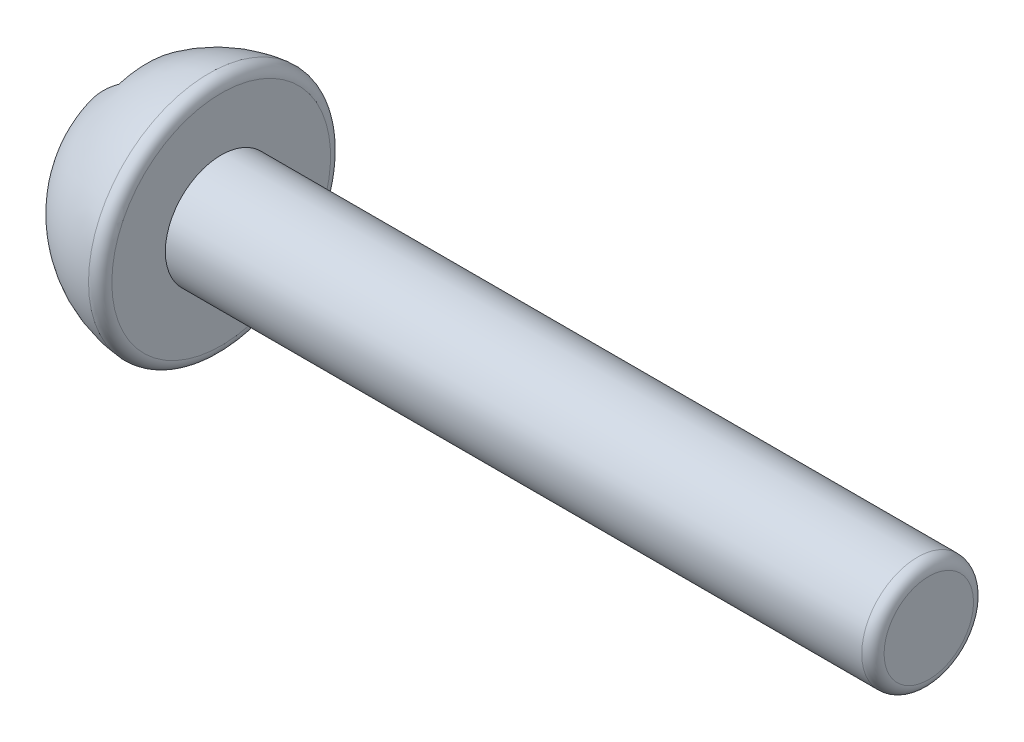
ISO-10303-21;
HEADER;
FILE_DESCRIPTION(('STEP AP214'),'2;1');
FILE_NAME('part.step','',(''),(''),'','','');
FILE_SCHEMA(('AUTOMOTIVE_DESIGN { 1 0 10303 214 1 1 1 1 }'));
ENDSEC;
DATA;
#1=APPLICATION_CONTEXT('core data for automotive mechanical design processes');
#2=APPLICATION_PROTOCOL_DEFINITION('international standard','automotive_design',2000,#1);
#3=PRODUCT_CONTEXT('',#1,'mechanical');
#4=PRODUCT('Part','Part','',(#3));
#5=PRODUCT_RELATED_PRODUCT_CATEGORY('part','',(#4));
#6=PRODUCT_DEFINITION_FORMATION('','',#4);
#7=PRODUCT_DEFINITION_CONTEXT('part definition',#1,'design');
#8=PRODUCT_DEFINITION('design','',#6,#7);
#9=PRODUCT_DEFINITION_SHAPE('','',#8);
#10=(LENGTH_UNIT() NAMED_UNIT(*) SI_UNIT(.MILLI.,.METRE.));
#11=(NAMED_UNIT(*) PLANE_ANGLE_UNIT() SI_UNIT($,.RADIAN.));
#12=(NAMED_UNIT(*) SI_UNIT($,.STERADIAN.) SOLID_ANGLE_UNIT());
#13=UNCERTAINTY_MEASURE_WITH_UNIT(LENGTH_MEASURE(1.E-05),#10,'distance_accuracy_value','');
#14=(GEOMETRIC_REPRESENTATION_CONTEXT(3) GLOBAL_UNCERTAINTY_ASSIGNED_CONTEXT((#13)) GLOBAL_UNIT_ASSIGNED_CONTEXT((#10,
#11,#12)) REPRESENTATION_CONTEXT('',''));
#15=CARTESIAN_POINT('',(0.,0.,0.));
#16=DIRECTION('',(0.,0.,1.));
#17=DIRECTION('',(1.,0.,0.));
#18=AXIS2_PLACEMENT_3D('',#15,#16,#17);
#19=CARTESIAN_POINT('',(-22.067620737631,-4.32416498627654E-08,0.));
#20=DIRECTION('',(-1.,0.,0.));
#21=DIRECTION('',(0.,0.,1.));
#22=AXIS2_PLACEMENT_3D('',#19,#20,#21);
#23=DEGENERATE_TOROIDAL_SURFACE('',#22,1.90491301343384,26.67,.F.);
#24=CARTESIAN_POINT('',(-24.4934308293997,-4.32416498627654E-08,0.));
#25=DIRECTION('',(1.,0.,0.));
#26=DIRECTION('',(0.,0.,-1.));
#27=AXIS2_PLACEMENT_3D('',#24,#25,#26);
#28=CIRCLE('',#27,24.6545362541747);
#29=CARTESIAN_POINT('',(-24.4934308293997,-4.32416498627654E-08,-24.6545362541747));
#30=VERTEX_POINT('',#29);
#31=EDGE_CURVE('E52',#30,#30,#28,.F.);
#32=ORIENTED_EDGE('',*,*,#31,.T.);
#33=EDGE_LOOP('',(#32));
#34=FACE_BOUND('',#33,.T.);
#35=CARTESIAN_POINT('',(-22.0714895535057,24.0966448384328,-5.715));
#36=CARTESIAN_POINT('',(-22.4361244723048,24.096590877898,-5.715));
#37=CARTESIAN_POINT('',(-22.8007177795977,24.088849782462,-5.715));
#38=CARTESIAN_POINT('',(-23.5292458995325,24.0580151985003,-5.715));
#39=CARTESIAN_POINT('',(-23.8931807276562,24.0349220757553,-5.715));
#40=CARTESIAN_POINT('',(-24.9829773197257,23.9426624510839,-5.715));
#41=CARTESIAN_POINT('',(-25.7070158056303,23.8505156416362,-5.715));
#42=CARTESIAN_POINT('',(-27.1446712361644,23.6055710255238,-5.715));
#43=CARTESIAN_POINT('',(-27.8582894146657,23.4527804610851,-5.715));
#44=CARTESIAN_POINT('',(-28.9169627425031,23.1789981312632,-5.715));
#45=CARTESIAN_POINT('',(-29.2679087960277,23.0802997213384,-5.715));
#46=CARTESIAN_POINT('',(-29.9654202310396,22.8681759094379,-5.715));
#47=CARTESIAN_POINT('',(-30.3119844618444,22.7547467237703,-5.715));
#48=CARTESIAN_POINT('',(-31.3442306670615,22.3926088040668,-5.715));
#49=CARTESIAN_POINT('',(-32.0223840591602,22.1220709457457,-5.715));
#50=CARTESIAN_POINT('',(-33.3534500748989,21.5247497473421,-5.715));
#51=CARTESIAN_POINT('',(-34.0063627466356,21.197966514443,-5.715));
#52=CARTESIAN_POINT('',(-34.9630062897767,20.6675250478347,-5.715));
#53=CARTESIAN_POINT('',(-35.2780559204697,20.4840296052563,-5.715));
#54=CARTESIAN_POINT('',(-35.900045778185,20.1039511619594,-5.715));
#55=CARTESIAN_POINT('',(-36.2069880617917,19.9073715257113,-5.715));
#56=CARTESIAN_POINT('',(-37.1149875363943,19.2983987892186,-5.715));
#57=CARTESIAN_POINT('',(-37.7032835889031,18.866735126589,-5.715));
#58=CARTESIAN_POINT('',(-38.8402145263512,17.9560534846728,-5.715));
#59=CARTESIAN_POINT('',(-39.3889160289397,17.4771184146399,-5.715));
#60=CARTESIAN_POINT('',(-40.4438746603184,16.4745302177951,-5.715));
#61=CARTESIAN_POINT('',(-40.9501312499793,15.9508765231443,-5.715));
#62=CARTESIAN_POINT('',(-41.9169744970546,14.8618380091056,-5.715));
#63=CARTESIAN_POINT('',(-42.3775048377737,14.2964031900953,-5.715));
#64=CARTESIAN_POINT('',(-43.2486090098142,13.1282933190146,-5.715));
#65=CARTESIAN_POINT('',(-43.6591844140949,12.5256194404129,-5.715));
#66=CARTESIAN_POINT('',(-44.4242083062479,11.2916163100681,-5.715));
#67=CARTESIAN_POINT('',(-44.7790392223492,10.6605243212926,-5.715));
#68=CARTESIAN_POINT('',(-45.4327852817211,9.36992045922785,-5.715));
#69=CARTESIAN_POINT('',(-45.7316937831532,8.71040522157344,-5.715));
#70=CARTESIAN_POINT('',(-46.2695886622245,7.36823443512176,-5.715));
#71=CARTESIAN_POINT('',(-46.5086567407336,6.68561189755952,-5.715));
#72=CARTESIAN_POINT('',(-46.8191331528736,5.64754119984467,-5.715));
#73=CARTESIAN_POINT('',(-46.9146055182085,5.29915561708614,-5.715));
#74=CARTESIAN_POINT('',(-47.0887763965613,4.59822791082223,-5.715));
#75=CARTESIAN_POINT('',(-47.1674755374269,4.24568594341821,-5.715));
#76=CARTESIAN_POINT('',(-47.3472194765031,3.33415858632676,-5.715));
#77=CARTESIAN_POINT('',(-47.435271720887,2.77250687431733,-5.715));
#78=CARTESIAN_POINT('',(-47.5316120849775,1.92616932086562,-5.715));
#79=CARTESIAN_POINT('',(-47.5577692543778,1.64341180783531,-5.715));
#80=CARTESIAN_POINT('',(-47.5977607558472,1.07700415730251,-5.715));
#81=CARTESIAN_POINT('',(-47.6115951998752,0.793354027933415,-5.715));
#82=CARTESIAN_POINT('',(-47.6266561094151,0.226348709991478,-5.715));
#83=CARTESIAN_POINT('',(-47.6279103003954,-0.0570057504105932,-5.715));
#84=CARTESIAN_POINT('',(-47.6178583664817,-0.623503222697366,-5.715));
#85=CARTESIAN_POINT('',(-47.6065517746921,-0.906646226330544,-5.715));
#86=CARTESIAN_POINT('',(-47.5716034517266,-1.47206172337444,-5.715));
#87=CARTESIAN_POINT('',(-47.547966090111,-1.75433448954506,-5.715));
#88=CARTESIAN_POINT('',(-47.4887571086059,-2.31762014903483,-5.715));
#89=CARTESIAN_POINT('',(-47.4531859339629,-2.59863308896133,-5.715));
#90=CARTESIAN_POINT('',(-47.395775959833,-2.9881200025378,-5.715));
#91=CARTESIAN_POINT('',(-47.3787875812706,-3.09732871179746,-5.715));
#92=CARTESIAN_POINT('',(-47.3430994814466,-3.31544511923724,-5.715));
#93=CARTESIAN_POINT('',(-47.3244001084505,-3.42435287404653,-5.715));
#94=CARTESIAN_POINT('',(-47.2853328558206,-3.64177192137902,-5.715));
#95=CARTESIAN_POINT('',(-47.2649664167676,-3.75028347330496,-5.715));
#96=CARTESIAN_POINT('',(-47.2225748359416,-3.967003746224,-5.715));
#97=CARTESIAN_POINT('',(-47.200549377036,-4.07521240519599,-5.715));
#98=CARTESIAN_POINT('',(-47.177710136777,-4.18324886841723,-5.715));
#99=B_SPLINE_CURVE_WITH_KNOTS('',3,(#35,#36,#37,#38,#39,#40,#41,#42,#43,#44,#45,#46,#47,#48,#49,
#50,#51,#52,#53,#54,#55,#56,#57,#58,#59,#60,#61,#62,#63,#64,#65,#66,#67,#68,#69,#70,#71,#72,#73,
#74,#75,#76,#77,#78,#79,#80,#81,#82,#83,#84,#85,#86,#87,#88,#89,#90,#91,#92,#93,#94,#95,#96,#97,
#98),.UNSPECIFIED.,.F.,.F.,(4,2,2,2,2,2,2,2,2,2,2,2,2,2,2,2,2,2,2,2,2,2,2,2,2,2,2,2,2,2,2,4),
(0.,1.09374297325524,2.18745988768477,4.37434167073137,6.56096236952935,7.65436102777853,
8.74804108984967,10.9356547809409,13.1232643032756,14.2167524495717,15.3099604944904,
17.4961500899712,19.678571257164,21.8610201409548,24.0461244404202,26.2311599184555,
28.4004806037927,30.5700587734287,32.7366584325255,33.8199940328087,34.9032890750449,
36.6066315470763,37.4583127411466,38.3099861971477,39.1597822467505,40.0096098850952,
40.8591365809081,41.7086315846944,42.0401885727674,42.3716782233836,42.702884384491,
43.0341540193068),.UNSPECIFIED.);
#100=CARTESIAN_POINT('',(-37.2395042501052,19.1964938695168,-5.715));
#101=VERTEX_POINT('',#100);
#102=CARTESIAN_POINT('',(-44.5878056698992,10.9847658281823,-5.715));
#103=VERTEX_POINT('',#102);
#104=EDGE_CURVE('E197',#101,#103,#99,.T.);
#105=ORIENTED_EDGE('',*,*,#104,.F.);
#106=CARTESIAN_POINT('',(-37.2395042501052,-4.32416498627654E-08,0.));
#107=DIRECTION('',(-1.,0.,0.));
#108=DIRECTION('',(0.,0.,1.));
#109=AXIS2_PLACEMENT_3D('',#106,#107,#108);
#110=CIRCLE('',#109,20.029143854458);
#111=CARTESIAN_POINT('',(-37.2395042501052,19.1964938695168,5.715));
#112=VERTEX_POINT('',#111);
#113=EDGE_CURVE('E144',#112,#101,#110,.T.);
#114=ORIENTED_EDGE('',*,*,#113,.F.);
#115=CARTESIAN_POINT('',(-47.1777101367769,-4.18324886841724,5.715));
#116=CARTESIAN_POINT('',(-47.237266547465,-3.90151847024972,5.715));
#117=CARTESIAN_POINT('',(-47.2912965675976,-3.61859996649744,5.715));
#118=CARTESIAN_POINT('',(-47.3877984859528,-3.05075066325797,5.715));
#119=CARTESIAN_POINT('',(-47.4302683613088,-2.7658195205246,5.715));
#120=CARTESIAN_POINT('',(-47.5031142478562,-2.19447992905748,5.715));
#121=CARTESIAN_POINT('',(-47.5334933146752,-1.90807187213207,5.715));
#122=CARTESIAN_POINT('',(-47.5816922065393,-1.3342137850991,5.715));
#123=CARTESIAN_POINT('',(-47.599512809921,-1.04676382067599,5.715));
#124=CARTESIAN_POINT('',(-47.6221785998498,-0.473438658517446,5.715));
#125=CARTESIAN_POINT('',(-47.6271169911622,-0.187567167031979,5.715));
#126=CARTESIAN_POINT('',(-47.6241865120437,0.384112813003679,5.715));
#127=CARTESIAN_POINT('',(-47.6163174587982,0.669921300596307,5.715));
#128=CARTESIAN_POINT('',(-47.5879324001465,1.24086250807976,5.715));
#129=CARTESIAN_POINT('',(-47.5674184941259,1.52599533226195,5.715));
#130=CARTESIAN_POINT('',(-47.5141150348808,2.09512124773631,5.715));
#131=CARTESIAN_POINT('',(-47.4813241308856,2.37911421013939,5.715));
#132=CARTESIAN_POINT('',(-47.3653801903852,3.22778265238754,5.715));
#133=CARTESIAN_POINT('',(-47.2646040762381,3.79013039478062,5.715));
#134=CARTESIAN_POINT('',(-47.0199633253977,4.9053075849446,5.715));
#135=CARTESIAN_POINT('',(-46.8760915112145,5.45813543096726,5.715));
#136=CARTESIAN_POINT('',(-46.5480103953126,6.55297658522699,5.715));
#137=CARTESIAN_POINT('',(-46.3637142471013,7.09496382549337,5.715));
#138=CARTESIAN_POINT('',(-45.9573277821755,8.16450727171893,5.715));
#139=CARTESIAN_POINT('',(-45.7352387937971,8.69206398412351,5.715));
#140=CARTESIAN_POINT('',(-45.2240808297018,9.79779683274116,5.715));
#141=CARTESIAN_POINT('',(-44.9300635188839,10.3736907634565,5.715));
#142=CARTESIAN_POINT('',(-44.298666662263,11.5012218647458,5.715));
#143=CARTESIAN_POINT('',(-43.9612833045185,12.0528568971978,5.715));
#144=CARTESIAN_POINT('',(-43.245681447712,13.1286346797844,5.715));
#145=CARTESIAN_POINT('',(-42.8674802763045,13.652788956522,5.715));
#146=CARTESIAN_POINT('',(-42.0725378970943,14.6710185691756,5.715));
#147=CARTESIAN_POINT('',(-41.6557949413908,15.165092539239,5.715));
#148=CARTESIAN_POINT('',(-40.7411563496175,16.1700444917511,5.715));
#149=CARTESIAN_POINT('',(-40.2393268452029,16.6773496639357,5.715));
#150=CARTESIAN_POINT('',(-39.1953388545377,17.6486634084321,5.715));
#151=CARTESIAN_POINT('',(-38.6531771941654,18.1126685665612,5.715));
#152=CARTESIAN_POINT('',(-37.5320391333387,18.994498086443,5.715));
#153=CARTESIAN_POINT('',(-36.9530431245702,19.4122975215631,5.715));
#154=CARTESIAN_POINT('',(-35.7625351949266,20.1986165066537,5.715));
#155=CARTESIAN_POINT('',(-35.1510242235579,20.5671374945567,5.715));
#156=CARTESIAN_POINT('',(-33.8883470186702,21.2586502929534,5.715));
#157=CARTESIAN_POINT('',(-33.2366636689465,21.5806983248475,5.715));
#158=CARTESIAN_POINT('',(-31.9084909508916,22.16896628407,5.715));
#159=CARTESIAN_POINT('',(-31.2319989267786,22.4351802137114,5.715));
#160=CARTESIAN_POINT('',(-29.859640218875,22.9096848798437,5.715));
#161=CARTESIAN_POINT('',(-29.1637906251679,23.1180250306289,5.715));
#162=CARTESIAN_POINT('',(-27.7573495767947,23.4755721877582,5.715));
#163=CARTESIAN_POINT('',(-27.0467634985131,23.6248003742794,5.715));
#164=CARTESIAN_POINT('',(-25.6269838222939,23.8612860804038,5.715));
#165=CARTESIAN_POINT('',(-24.917950640102,23.9494990298828,5.715));
#166=CARTESIAN_POINT('',(-23.8515739292758,24.0377067538901,5.715));
#167=CARTESIAN_POINT('',(-23.4959303418929,24.0597573261935,5.715));
#168=CARTESIAN_POINT('',(-22.7840350397205,24.0891997008069,5.715));
#169=CARTESIAN_POINT('',(-22.427783321791,24.0965914271985,5.715));
#170=CARTESIAN_POINT('',(-22.0714895535057,24.0966448384328,5.715));
#171=B_SPLINE_CURVE_WITH_KNOTS('',3,(#115,#116,#117,#118,#119,#120,#121,#122,#123,#124,#125,
#126,#127,#128,#129,#130,#131,#132,#133,#134,#135,#136,#137,#138,#139,#140,#141,#142,#143,#144,
#145,#146,#147,#148,#149,#150,#151,#152,#153,#154,#155,#156,#157,#158,#159,#160,#161,#162,#163,
#164,#165,#166,#167,#168,#169,#170),.UNSPECIFIED.,.F.,.F.,(4,2,2,2,2,2,2,2,2,2,2,2,2,2,2,2,2,2,
2,2,2,2,2,2,2,2,2,4),(0.,0.86384311243642,1.72783728851963,2.59161297438228,3.45533512125312,
4.31279054935567,5.17025821695415,6.02758356018625,6.88500325794943,8.59689990715931,
10.3090818275026,12.0249788214357,13.7408155177802,15.6786567037235,17.6166683454901,
19.5538604900726,21.4911405309843,23.6293677939194,25.7677635127182,27.9073072632609,
30.0467885688352,32.2249570245264,34.40335933889,36.5798959133932,38.7556519146176,
40.8965158648648,41.9652342895749,43.0339582491742),.UNSPECIFIED.);
#172=CARTESIAN_POINT('',(-44.5878056698941,10.9847658281823,5.715));
#173=VERTEX_POINT('',#172);
#174=EDGE_CURVE('E224',#173,#112,#171,.T.);
#175=ORIENTED_EDGE('',*,*,#174,.F.);
#176=CARTESIAN_POINT('',(-44.5877489446472,-10.9851788388394,5.71439999999969));
#177=CARTESIAN_POINT('',(-44.616953060799,-10.7726528711165,6.02330024223776));
#178=CARTESIAN_POINT('',(-44.6452753814601,-10.5469970373811,6.32324518961711));
#179=CARTESIAN_POINT('',(-44.6999771216694,-10.0711472036601,6.90317205877171));
#180=CARTESIAN_POINT('',(-44.7263565906833,-9.82095382878962,7.18315448879567));
#181=CARTESIAN_POINT('',(-44.7769813904609,-9.29787827121447,7.72097712441806));
#182=CARTESIAN_POINT('',(-44.801227846046,-9.02500819626191,7.97882899855378));
#183=CARTESIAN_POINT('',(-44.8474408454129,-8.45839893683442,8.47069674836538));
#184=CARTESIAN_POINT('',(-44.8694074318687,-8.16466014314776,8.70471307018694));
#185=CARTESIAN_POINT('',(-44.9109148403433,-7.55837067365629,9.14722298909467));
#186=CARTESIAN_POINT('',(-44.930455577689,-7.24581934177376,9.35571569528751));
#187=CARTESIAN_POINT('',(-44.9669793332649,-6.60413322611332,9.74564998272805));
#188=CARTESIAN_POINT('',(-44.9839623592259,-6.27499849246368,9.92709164573902));
#189=CARTESIAN_POINT('',(-45.0152522403547,-5.60258035268655,10.2615523011105));
#190=CARTESIAN_POINT('',(-45.0295598200256,-5.25930080775072,10.4145789880854));
#191=CARTESIAN_POINT('',(-45.0554079085921,-4.56096424961518,10.6911474592027));
#192=CARTESIAN_POINT('',(-45.0669484401322,-4.20590733282473,10.8146894846379));
#193=CARTESIAN_POINT('',(-45.0871436993661,-3.48800897760566,11.0309447529661));
#194=CARTESIAN_POINT('',(-45.0958098699967,-3.12520467943903,11.1237802355724));
#195=CARTESIAN_POINT('',(-45.1102618423261,-2.39301951683392,11.278625579207));
#196=CARTESIAN_POINT('',(-45.116047645736,-2.02363865630241,11.3406354585474));
#197=CARTESIAN_POINT('',(-45.1247006676646,-1.28086917764156,11.4333838638921));
#198=CARTESIAN_POINT('',(-45.1275673534668,-0.907479840555392,11.4641166820717));
#199=CARTESIAN_POINT('',(-45.1303609340396,-0.159428819640929,11.4940656873112));
#200=CARTESIAN_POINT('',(-45.1302878348527,0.215232861570633,11.4932819391498));
#201=CARTESIAN_POINT('',(-45.1272061255526,0.962238507521035,11.4602441724724));
#202=CARTESIAN_POINT('',(-45.1242046666152,1.33458589491153,11.4280668184414));
#203=CARTESIAN_POINT('',(-45.1152969448805,2.07523402900248,11.3325896983799));
#204=CARTESIAN_POINT('',(-45.1093906800046,2.44353477280703,11.2692899100787));
#205=CARTESIAN_POINT('',(-45.094713646836,3.17343867806363,11.1120366110691));
#206=CARTESIAN_POINT('',(-45.085943143291,3.53504245526743,11.0180859334884));
#207=CARTESIAN_POINT('',(-45.0655962963718,4.24901994167014,10.800213840784));
#208=CARTESIAN_POINT('',(-45.0540199817923,4.60139374555103,10.6762927332335));
#209=CARTESIAN_POINT('',(-45.0281335648518,5.29456261782225,10.3993231149939));
#210=CARTESIAN_POINT('',(-45.0138223578971,5.63535294203884,10.2462628354025));
#211=CARTESIAN_POINT('',(-44.9825637101673,6.30281613678232,9.91214715819994));
#212=CARTESIAN_POINT('',(-44.9656161520628,6.62948837816542,9.73109051462998));
#213=CARTESIAN_POINT('',(-44.9292013711641,7.26634399093019,9.34233189432788));
#214=CARTESIAN_POINT('',(-44.909734555969,7.57653001824529,9.13463422798641));
#215=CARTESIAN_POINT('',(-44.8684094811893,8.17826802310354,8.69408000553131));
#216=CARTESIAN_POINT('',(-44.846551633874,8.46982319934564,8.46122778673005));
#217=CARTESIAN_POINT('',(-44.8062694866452,8.96278492674142,8.0324933032567));
#218=CARTESIAN_POINT('',(-44.7883305661027,9.1686711362583,7.84168490677379));
#219=CARTESIAN_POINT('',(-44.7512458552708,9.56794429493295,7.44752334838583));
#220=CARTESIAN_POINT('',(-44.7321001341298,9.76133195896089,7.24417090525605));
#221=CARTESIAN_POINT('',(-44.6926977249351,10.1346105971817,6.82600128994293));
#222=CARTESIAN_POINT('',(-44.6724424568869,10.3145181555836,6.61119878068445));
#223=CARTESIAN_POINT('',(-44.6308714517871,10.6604463800933,6.17072632600474));
#224=CARTESIAN_POINT('',(-44.6095555334789,10.8264646595484,5.9450545233223));
#225=CARTESIAN_POINT('',(-44.5877489446472,10.9851787523561,5.71439999999969));
#226=B_SPLINE_CURVE_WITH_KNOTS('',3,(#176,#177,#178,#179,#180,#181,#182,#183,#184,#185,#186,
#187,#188,#189,#190,#191,#192,#193,#194,#195,#196,#197,#198,#199,#200,#201,#202,#203,#204,#205,
#206,#207,#208,#209,#210,#211,#212,#213,#214,#215,#216,#217,#218,#219,#220,#221,#222,#223,#224,
#225),.UNSPECIFIED.,.F.,.F.,(4,2,2,2,2,2,2,2,2,2,2,2,2,2,2,2,2,2,2,2,2,2,2,2,4),(0.,
1.12791497413899,2.25580122112938,3.38308907888799,4.51035583258135,5.63766192193488,
6.7649646038743,7.89196157202726,9.018949316888,10.141395068687,11.263840153694,
12.3864900396464,13.5091376181233,14.6290504893236,15.7489641619186,16.8687743478,
17.9885730420567,19.1088249704721,20.22912676928,21.3492475366886,22.4691754728985,
23.3124903074673,24.1557568648082,24.9979683335596,25.8403242270437),.UNSPECIFIED.);
#227=CARTESIAN_POINT('',(-44.5878056698992,-10.9847659146656,5.715));
#228=VERTEX_POINT('',#227);
#229=EDGE_CURVE('E230',#228,#173,#226,.T.);
#230=ORIENTED_EDGE('',*,*,#229,.F.);
#231=CARTESIAN_POINT('',(-22.0714895535057,-24.0966449249161,5.715));
#232=CARTESIAN_POINT('',(-22.4361244723048,-24.0965909643813,5.715));
#233=CARTESIAN_POINT('',(-22.8007177795977,-24.0888498689453,5.715));
#234=CARTESIAN_POINT('',(-23.5292458995325,-24.0580152849836,5.715));
#235=CARTESIAN_POINT('',(-23.8931807276562,-24.0349221622386,5.715));
#236=CARTESIAN_POINT('',(-24.9829773197257,-23.9426625375672,5.715));
#237=CARTESIAN_POINT('',(-25.7070158056303,-23.8505157281195,5.715));
#238=CARTESIAN_POINT('',(-27.1446712361644,-23.6055711120071,5.715));
#239=CARTESIAN_POINT('',(-27.8582894146657,-23.4527805475684,5.71499999999999));
#240=CARTESIAN_POINT('',(-28.9169627425031,-23.1789982177465,5.715));
#241=CARTESIAN_POINT('',(-29.2679087960277,-23.0802998078217,5.715));
#242=CARTESIAN_POINT('',(-29.9654202310396,-22.8681759959212,5.715));
#243=CARTESIAN_POINT('',(-30.3119844618444,-22.7547468102536,5.715));
#244=CARTESIAN_POINT('',(-31.3442306670615,-22.3926088905501,5.715));
#245=CARTESIAN_POINT('',(-32.0223840591602,-22.122071032229,5.715));
#246=CARTESIAN_POINT('',(-33.3534500748989,-21.5247498338254,5.715));
#247=CARTESIAN_POINT('',(-34.0063627466356,-21.1979666009263,5.715));
#248=CARTESIAN_POINT('',(-34.9630062897767,-20.667525134318,5.715));
#249=CARTESIAN_POINT('',(-35.2780559204697,-20.4840296917396,5.715));
#250=CARTESIAN_POINT('',(-35.900045778185,-20.1039512484427,5.715));
#251=CARTESIAN_POINT('',(-36.2069880617917,-19.9073716121946,5.715));
#252=CARTESIAN_POINT('',(-37.1149875363943,-19.2983988757019,5.715));
#253=CARTESIAN_POINT('',(-37.7032835889031,-18.8667352130723,5.715));
#254=CARTESIAN_POINT('',(-38.8402145263512,-17.9560535711561,5.715));
#255=CARTESIAN_POINT('',(-39.3889160289397,-17.4771185011232,5.715));
#256=CARTESIAN_POINT('',(-40.4438746603184,-16.4745303042784,5.715));
#257=CARTESIAN_POINT('',(-40.9501312499793,-15.9508766096276,5.715));
#258=CARTESIAN_POINT('',(-41.9169744970546,-14.8618380955889,5.715));
#259=CARTESIAN_POINT('',(-42.3775048377737,-14.2964032765786,5.715));
#260=CARTESIAN_POINT('',(-43.2486090098142,-13.1282934054979,5.715));
#261=CARTESIAN_POINT('',(-43.6591844140949,-12.5256195268962,5.715));
#262=CARTESIAN_POINT('',(-44.4242083062479,-11.2916163965514,5.715));
#263=CARTESIAN_POINT('',(-44.7790392223492,-10.6605244077759,5.715));
#264=CARTESIAN_POINT('',(-45.4327852817211,-9.36992054571115,5.715));
#265=CARTESIAN_POINT('',(-45.7316937831532,-8.71040530805674,5.715));
#266=CARTESIAN_POINT('',(-46.2695886622245,-7.36823452160506,5.715));
#267=CARTESIAN_POINT('',(-46.5086567407336,-6.68561198404282,5.715));
#268=CARTESIAN_POINT('',(-46.8191331528736,-5.64754128632797,5.715));
#269=CARTESIAN_POINT('',(-46.9146055182085,-5.29915570356944,5.715));
#270=CARTESIAN_POINT('',(-47.0887763965613,-4.59822799730553,5.715));
#271=CARTESIAN_POINT('',(-47.1674755374269,-4.24568602990151,5.715));
#272=CARTESIAN_POINT('',(-47.3472194765031,-3.33415867281005,5.715));
#273=CARTESIAN_POINT('',(-47.435271720887,-2.77250696080062,5.715));
#274=CARTESIAN_POINT('',(-47.5316120849775,-1.92616940734891,5.715));
#275=CARTESIAN_POINT('',(-47.5577692543778,-1.64341189431861,5.715));
#276=CARTESIAN_POINT('',(-47.5977607558472,-1.07700424378581,5.715));
#277=CARTESIAN_POINT('',(-47.6115951998752,-0.793354114416712,5.71500000000001));
#278=CARTESIAN_POINT('',(-47.626656109415,-0.226348796474775,5.71500000000001));
#279=CARTESIAN_POINT('',(-47.6279103003954,0.0570056639272943,5.71500000000001));
#280=CARTESIAN_POINT('',(-47.6178583664817,0.623503136214067,5.71500000000001));
#281=CARTESIAN_POINT('',(-47.6065517746921,0.906646139847244,5.71500000000001));
#282=CARTESIAN_POINT('',(-47.5716034517266,1.47206163689114,5.71500000000001));
#283=CARTESIAN_POINT('',(-47.547966090111,1.75433440306177,5.71500000000001));
#284=CARTESIAN_POINT('',(-47.4887571086059,2.31762006255153,5.71500000000001));
#285=CARTESIAN_POINT('',(-47.4531859339629,2.59863300247803,5.71500000000001));
#286=CARTESIAN_POINT('',(-47.395775959833,2.9881199160545,5.71500000000001));
#287=CARTESIAN_POINT('',(-47.3787875812706,3.09732862531417,5.71500000000001));
#288=CARTESIAN_POINT('',(-47.3430994814466,3.31544503275394,5.71500000000001));
#289=CARTESIAN_POINT('',(-47.3244001084505,3.42435278756323,5.71500000000001));
#290=CARTESIAN_POINT('',(-47.2853328558206,3.64177183489573,5.71500000000001));
#291=CARTESIAN_POINT('',(-47.2649664167676,3.75028338682166,5.71500000000001));
#292=CARTESIAN_POINT('',(-47.2225748359416,3.9670036597407,5.71500000000001));
#293=CARTESIAN_POINT('',(-47.200549377036,4.07521231871269,5.71500000000001));
#294=CARTESIAN_POINT('',(-47.177710136777,4.18324878193394,5.71500000000001));
#295=B_SPLINE_CURVE_WITH_KNOTS('',3,(#231,#232,#233,#234,#235,#236,#237,#238,#239,#240,#241,
#242,#243,#244,#245,#246,#247,#248,#249,#250,#251,#252,#253,#254,#255,#256,#257,#258,#259,#260,
#261,#262,#263,#264,#265,#266,#267,#268,#269,#270,#271,#272,#273,#274,#275,#276,#277,#278,#279,
#280,#281,#282,#283,#284,#285,#286,#287,#288,#289,#290,#291,#292,#293,#294),.UNSPECIFIED.,.F.,
.F.,(4,2,2,2,2,2,2,2,2,2,2,2,2,2,2,2,2,2,2,2,2,2,2,2,2,2,2,2,2,2,2,4),(0.,1.09374297325524,
2.18745988768477,4.37434167073137,6.56096236952935,7.65436102777853,8.74804108984967,
10.9356547809409,13.1232643032756,14.2167524495717,15.3099604944904,17.4961500899712,
19.678571257164,21.8610201409548,24.0461244404202,26.2311599184555,28.4004806037927,
30.5700587734287,32.7366584325255,33.8199940328087,34.9032890750449,36.6066315470763,
37.4583127411466,38.3099861971477,39.1597822467505,40.0096098850951,40.8591365809081,
41.7086315846944,42.0401885727674,42.3716782233836,42.7028843844909,43.0341540193068),.UNSPECIFIED.);
#296=CARTESIAN_POINT('',(-37.2395042501052,-19.1964939560001,5.715));
#297=VERTEX_POINT('',#296);
#298=EDGE_CURVE('E153',#297,#228,#295,.T.);
#299=ORIENTED_EDGE('',*,*,#298,.F.);
#300=CARTESIAN_POINT('',(-37.2395042501052,-19.1964939560001,-5.715));
#301=VERTEX_POINT('',#300);
#302=EDGE_CURVE('E141',#301,#297,#110,.T.);
#303=ORIENTED_EDGE('',*,*,#302,.F.);
#304=CARTESIAN_POINT('',(-47.1777101367769,4.18324878193393,-5.71499999999999));
#305=CARTESIAN_POINT('',(-47.237266547465,3.90151838376641,-5.71499999999999));
#306=CARTESIAN_POINT('',(-47.2912965675976,3.61859988001413,-5.71499999999999));
#307=CARTESIAN_POINT('',(-47.3877984859528,3.05075057677466,-5.71499999999999));
#308=CARTESIAN_POINT('',(-47.4302683613088,2.76581943404128,-5.71499999999999));
#309=CARTESIAN_POINT('',(-47.5031142478562,2.19447984257417,-5.71499999999999));
#310=CARTESIAN_POINT('',(-47.5334933146752,1.90807178564875,-5.71499999999999));
#311=CARTESIAN_POINT('',(-47.5816922065393,1.33421369861578,-5.71499999999999));
#312=CARTESIAN_POINT('',(-47.599512809921,1.04676373419268,-5.71499999999999));
#313=CARTESIAN_POINT('',(-47.6221785998498,0.473438572034136,-5.71499999999999));
#314=CARTESIAN_POINT('',(-47.6271169911622,0.187567080548669,-5.71499999999999));
#315=CARTESIAN_POINT('',(-47.6241865120437,-0.38411289948699,-5.71499999999999));
#316=CARTESIAN_POINT('',(-47.6163174587982,-0.669921387079618,-5.71499999999999));
#317=CARTESIAN_POINT('',(-47.5879324001465,-1.24086259456308,-5.71499999999999));
#318=CARTESIAN_POINT('',(-47.5674184941259,-1.52599541874526,-5.71499999999999));
#319=CARTESIAN_POINT('',(-47.5141150348809,-2.09512133421962,-5.71499999999999));
#320=CARTESIAN_POINT('',(-47.4813241308857,-2.3791142966227,-5.71499999999999));
#321=CARTESIAN_POINT('',(-47.3653801903852,-3.22778273887084,-5.71499999999999));
#322=CARTESIAN_POINT('',(-47.2646040762381,-3.79013048126393,-5.71499999999999));
#323=CARTESIAN_POINT('',(-47.0199633253977,-4.9053076714279,-5.715));
#324=CARTESIAN_POINT('',(-46.8760915112145,-5.45813551745057,-5.715));
#325=CARTESIAN_POINT('',(-46.5480103953126,-6.55297667171029,-5.715));
#326=CARTESIAN_POINT('',(-46.3637142471013,-7.09496391197668,-5.715));
#327=CARTESIAN_POINT('',(-45.9573277821755,-8.16450735820223,-5.715));
#328=CARTESIAN_POINT('',(-45.7352387937971,-8.69206407060681,-5.715));
#329=CARTESIAN_POINT('',(-45.2240808297018,-9.79779691922446,-5.715));
#330=CARTESIAN_POINT('',(-44.9300635188839,-10.3736908499398,-5.715));
#331=CARTESIAN_POINT('',(-44.298666662263,-11.5012219512291,-5.715));
#332=CARTESIAN_POINT('',(-43.9612833045185,-12.0528569836811,-5.715));
#333=CARTESIAN_POINT('',(-43.245681447712,-13.1286347662677,-5.715));
#334=CARTESIAN_POINT('',(-42.8674802763045,-13.6527890430053,-5.715));
#335=CARTESIAN_POINT('',(-42.0725378970943,-14.6710186556589,-5.715));
#336=CARTESIAN_POINT('',(-41.6557949413908,-15.1650926257223,-5.715));
#337=CARTESIAN_POINT('',(-40.7411563496175,-16.1700445782344,-5.715));
#338=CARTESIAN_POINT('',(-40.2393268452029,-16.677349750419,-5.715));
#339=CARTESIAN_POINT('',(-39.1953388545377,-17.6486634949154,-5.715));
#340=CARTESIAN_POINT('',(-38.6531771941654,-18.1126686530445,-5.715));
#341=CARTESIAN_POINT('',(-37.5320391333387,-18.9944981729263,-5.715));
#342=CARTESIAN_POINT('',(-36.9530431245702,-19.4122976080464,-5.715));
#343=CARTESIAN_POINT('',(-35.7625351949266,-20.198616593137,-5.715));
#344=CARTESIAN_POINT('',(-35.1510242235579,-20.56713758104,-5.715));
#345=CARTESIAN_POINT('',(-33.8883470186701,-21.2586503794367,-5.715));
#346=CARTESIAN_POINT('',(-33.2366636689465,-21.5806984113308,-5.715));
#347=CARTESIAN_POINT('',(-31.9084909508916,-22.1689663705533,-5.715));
#348=CARTESIAN_POINT('',(-31.2319989267786,-22.4351803001947,-5.715));
#349=CARTESIAN_POINT('',(-29.859640218875,-22.909684966327,-5.715));
#350=CARTESIAN_POINT('',(-29.1637906251679,-23.1180251171122,-5.715));
#351=CARTESIAN_POINT('',(-27.7573495767947,-23.4755722742415,-5.715));
#352=CARTESIAN_POINT('',(-27.0467634985131,-23.6248004607627,-5.715));
#353=CARTESIAN_POINT('',(-25.6269838222938,-23.8612861668871,-5.715));
#354=CARTESIAN_POINT('',(-24.917950640102,-23.9494991163661,-5.715));
#355=CARTESIAN_POINT('',(-23.8515739292758,-24.0377068403734,-5.715));
#356=CARTESIAN_POINT('',(-23.4959303418929,-24.0597574126768,-5.715));
#357=CARTESIAN_POINT('',(-22.7840350397205,-24.0891997872902,-5.715));
#358=CARTESIAN_POINT('',(-22.427783321791,-24.0965915136818,-5.715));
#359=CARTESIAN_POINT('',(-22.0714895535057,-24.0966449249161,-5.715));
#360=B_SPLINE_CURVE_WITH_KNOTS('',3,(#304,#305,#306,#307,#308,#309,#310,#311,#312,#313,#314,
#315,#316,#317,#318,#319,#320,#321,#322,#323,#324,#325,#326,#327,#328,#329,#330,#331,#332,#333,
#334,#335,#336,#337,#338,#339,#340,#341,#342,#343,#344,#345,#346,#347,#348,#349,#350,#351,#352,
#353,#354,#355,#356,#357,#358,#359),.UNSPECIFIED.,.F.,.F.,(4,2,2,2,2,2,2,2,2,2,2,2,2,2,2,2,2,2,
2,2,2,2,2,2,2,2,2,4),(0.,0.863843112436421,1.72783728851963,2.59161297438228,3.45533512125312,
4.31279054935567,5.17025821695416,6.02758356018625,6.88500325794943,8.59689990715931,
10.3090818275026,12.0249788214357,13.7408155177802,15.6786567037235,17.6166683454901,
19.5538604900726,21.4911405309843,23.6293677939194,25.7677635127182,27.9073072632609,
30.0467885688352,32.2249570245264,34.4033593388901,36.5798959133932,38.7556519146177,
40.8965158648648,41.9652342895749,43.0339582491742),.UNSPECIFIED.);
#361=CARTESIAN_POINT('',(-44.5878056698992,-10.9847659146656,-5.715));
#362=VERTEX_POINT('',#361);
#363=EDGE_CURVE('E100',#362,#301,#360,.T.);
#364=ORIENTED_EDGE('',*,*,#363,.F.);
#365=CARTESIAN_POINT('',(-44.5877489446472,10.9851787523561,-5.71439999999969));
#366=CARTESIAN_POINT('',(-44.616953060799,10.7726527846332,-6.02330024223775));
#367=CARTESIAN_POINT('',(-44.6452753814601,10.5469969508978,-6.32324518961711));
#368=CARTESIAN_POINT('',(-44.6999771216694,10.0711471171768,-6.90317205877171));
#369=CARTESIAN_POINT('',(-44.7263565906833,9.82095374230632,-7.18315448879567));
#370=CARTESIAN_POINT('',(-44.7769813904609,9.29787818473117,-7.72097712441805));
#371=CARTESIAN_POINT('',(-44.801227846046,9.02500810977861,-7.97882899855377));
#372=CARTESIAN_POINT('',(-44.8474408454129,8.45839885035113,-8.47069674836538));
#373=CARTESIAN_POINT('',(-44.8694074318687,8.16466005666446,-8.70471307018693));
#374=CARTESIAN_POINT('',(-44.9109148403433,7.55837058717299,-9.14722298909466));
#375=CARTESIAN_POINT('',(-44.930455577689,7.24581925529047,-9.35571569528751));
#376=CARTESIAN_POINT('',(-44.9669793332649,6.60413313963002,-9.74564998272804));
#377=CARTESIAN_POINT('',(-44.9839623592259,6.27499840598038,-9.92709164573902));
#378=CARTESIAN_POINT('',(-45.0152522403547,5.60258026620325,-10.2615523011105));
#379=CARTESIAN_POINT('',(-45.0295598200256,5.25930072126742,-10.4145789880854));
#380=CARTESIAN_POINT('',(-45.0554079085921,4.56096416313188,-10.6911474592027));
#381=CARTESIAN_POINT('',(-45.0669484401322,4.20590724634143,-10.8146894846379));
#382=CARTESIAN_POINT('',(-45.0871436993661,3.48800889112236,-11.0309447529661));
#383=CARTESIAN_POINT('',(-45.0958098699967,3.12520459295572,-11.1237802355724));
#384=CARTESIAN_POINT('',(-45.1102618423261,2.39301943035062,-11.278625579207));
#385=CARTESIAN_POINT('',(-45.116047645736,2.02363856981911,-11.3406354585474));
#386=CARTESIAN_POINT('',(-45.1247006676646,1.28086909115826,-11.4333838638921));
#387=CARTESIAN_POINT('',(-45.1275673534668,0.907479754072094,-11.4641166820717));
#388=CARTESIAN_POINT('',(-45.1303609340396,0.15942873315763,-11.4940656873112));
#389=CARTESIAN_POINT('',(-45.1302878348527,-0.215232948053932,-11.4932819391498));
#390=CARTESIAN_POINT('',(-45.1272061255526,-0.962238594004334,-11.4602441724724));
#391=CARTESIAN_POINT('',(-45.1242046666152,-1.33458598139483,-11.4280668184414));
#392=CARTESIAN_POINT('',(-45.1152969448805,-2.07523411548578,-11.3325896983799));
#393=CARTESIAN_POINT('',(-45.1093906800046,-2.44353485929033,-11.2692899100787));
#394=CARTESIAN_POINT('',(-45.094713646836,-3.17343876454692,-11.1120366110691));
#395=CARTESIAN_POINT('',(-45.085943143291,-3.53504254175072,-11.0180859334884));
#396=CARTESIAN_POINT('',(-45.0655962963718,-4.24902002815344,-10.800213840784));
#397=CARTESIAN_POINT('',(-45.0540199817923,-4.60139383203433,-10.6762927332335));
#398=CARTESIAN_POINT('',(-45.0281335648517,-5.29456270430555,-10.3993231149939));
#399=CARTESIAN_POINT('',(-45.0138223578971,-5.63535302852214,-10.2462628354025));
#400=CARTESIAN_POINT('',(-44.9825637101673,-6.30281622326562,-9.91214715819994));
#401=CARTESIAN_POINT('',(-44.9656161520628,-6.62948846464872,-9.73109051462998));
#402=CARTESIAN_POINT('',(-44.9292013711641,-7.26634407741349,-9.34233189432788));
#403=CARTESIAN_POINT('',(-44.909734555969,-7.57653010472859,-9.13463422798642));
#404=CARTESIAN_POINT('',(-44.8684094811893,-8.17826810958684,-8.69408000553132));
#405=CARTESIAN_POINT('',(-44.846551633874,-8.46982328582894,-8.46122778673005));
#406=CARTESIAN_POINT('',(-44.8062694866451,-8.96278501322472,-8.0324933032567));
#407=CARTESIAN_POINT('',(-44.7883305661027,-9.1686712227416,-7.84168490677379));
#408=CARTESIAN_POINT('',(-44.7512458552708,-9.56794438141625,-7.44752334838583));
#409=CARTESIAN_POINT('',(-44.7321001341298,-9.7613320454442,-7.24417090525605));
#410=CARTESIAN_POINT('',(-44.6926977249351,-10.134610683665,-6.82600128994293));
#411=CARTESIAN_POINT('',(-44.6724424568869,-10.3145182420669,-6.61119878068445));
#412=CARTESIAN_POINT('',(-44.6308714517871,-10.6604464665766,-6.17072632600474));
#413=CARTESIAN_POINT('',(-44.6095555334789,-10.8264647460317,-5.94505452332229));
#414=CARTESIAN_POINT('',(-44.5877489446472,-10.9851788388394,-5.71439999999969));
#415=B_SPLINE_CURVE_WITH_KNOTS('',3,(#365,#366,#367,#368,#369,#370,#371,#372,#373,#374,#375,
#376,#377,#378,#379,#380,#381,#382,#383,#384,#385,#386,#387,#388,#389,#390,#391,#392,#393,#394,
#395,#396,#397,#398,#399,#400,#401,#402,#403,#404,#405,#406,#407,#408,#409,#410,#411,#412,#413,
#414),.UNSPECIFIED.,.F.,.F.,(4,2,2,2,2,2,2,2,2,2,2,2,2,2,2,2,2,2,2,2,2,2,2,2,4),(0.,
1.12791497413899,2.25580122112938,3.38308907888798,4.51035583258135,5.63766192193488,
6.7649646038743,7.89196157202726,9.018949316888,10.141395068687,11.263840153694,
12.3864900396464,13.5091376181233,14.6290504893236,15.7489641619186,16.8687743478,
17.9885730420567,19.1088249704721,20.22912676928,21.3492475366886,22.4691754728985,
23.3124903074673,24.1557568648082,24.9979683335596,25.8403242270437),.UNSPECIFIED.);
#416=EDGE_CURVE('E67',#103,#362,#415,.T.);
#417=ORIENTED_EDGE('',*,*,#416,.F.);
#418=EDGE_LOOP('',(#105,#114,#175,#230,#299,#303,#364,#417));
#419=FACE_BOUND('',#418,.T.);
#420=ADVANCED_FACE('F43',(#34,#419),#23,.F.);
#421=CARTESIAN_POINT('',(122.780495749895,-4.32416498627654E-08,0.));
#422=DIRECTION('',(-1.,0.,0.));
#423=DIRECTION('',(0.,0.,1.));
#424=AXIS2_PLACEMENT_3D('',#421,#422,#423);
#425=PLANE('',#424);
#426=CARTESIAN_POINT('',(122.780495749895,-4.32416498627654E-08,0.));
#427=DIRECTION('',(-1.,0.,0.));
#428=DIRECTION('',(0.,0.,1.));
#429=AXIS2_PLACEMENT_3D('',#426,#427,#428);
#430=CIRCLE('',#429,9.14399999999999);
#431=CARTESIAN_POINT('',(122.780495749895,-4.32416498627654E-08,9.14399999999999));
#432=VERTEX_POINT('',#431);
#433=EDGE_CURVE('E188',#432,#432,#430,.F.);
#434=ORIENTED_EDGE('',*,*,#433,.T.);
#435=EDGE_LOOP('',(#434));
#436=FACE_BOUND('',#435,.T.);
#437=ADVANCED_FACE('F178',(#436),#425,.F.);
#438=CARTESIAN_POINT('',(-48.6695042501052,-4.32416498627654E-08,0.));
#439=DIRECTION('',(-1.,0.,0.));
#440=DIRECTION('',(0.,0.,1.));
#441=AXIS2_PLACEMENT_3D('',#438,#439,#440);
#442=CYLINDRICAL_SURFACE('',#441,11.43);
#443=CARTESIAN_POINT('',(120.494495749895,-4.32416498627654E-08,0.));
#444=DIRECTION('',(-1.,0.,0.));
#445=DIRECTION('',(0.,0.,1.));
#446=AXIS2_PLACEMENT_3D('',#443,#444,#445);
#447=CIRCLE('',#446,11.43);
#448=CARTESIAN_POINT('',(120.494495749895,-4.32416498627654E-08,11.43));
#449=VERTEX_POINT('',#448);
#450=EDGE_CURVE('E191',#449,#449,#447,.T.);
#451=ORIENTED_EDGE('',*,*,#450,.T.);
#452=EDGE_LOOP('',(#451));
#453=FACE_BOUND('',#452,.T.);
#454=CARTESIAN_POINT('',(-21.9995042501052,-4.32416498627654E-08,0.));
#455=DIRECTION('',(-1.,0.,0.));
#456=DIRECTION('',(0.,0.,1.));
#457=AXIS2_PLACEMENT_3D('',#454,#455,#456);
#458=CIRCLE('',#457,11.43);
#459=CARTESIAN_POINT('',(-21.9995042501052,-4.32416498627654E-08,11.43));
#460=VERTEX_POINT('',#459);
#461=EDGE_CURVE('E109',#460,#460,#458,.T.);
#462=ORIENTED_EDGE('',*,*,#461,.F.);
#463=EDGE_LOOP('',(#462));
#464=FACE_BOUND('',#463,.T.);
#465=ADVANCED_FACE('F175',(#453,#464),#442,.T.);
#466=CARTESIAN_POINT('',(-21.9995042501052,11.4299999567583,0.));
#467=DIRECTION('',(-1.,0.,0.));
#468=DIRECTION('',(0.,0.,1.));
#469=AXIS2_PLACEMENT_3D('',#466,#467,#468);
#470=PLANE('',#469);
#471=CARTESIAN_POINT('',(-21.9995042501052,-4.32416498627654E-08,0.));
#472=DIRECTION('',(-1.,0.,0.));
#473=DIRECTION('',(0.,0.,1.));
#474=AXIS2_PLACEMENT_3D('',#471,#472,#473);
#475=CIRCLE('',#474,22.3780120312368);
#476=CARTESIAN_POINT('',(-21.9995042501052,-4.32416498627654E-08,22.3780120312368));
#477=VERTEX_POINT('',#476);
#478=EDGE_CURVE('E11',#477,#477,#475,.F.);
#479=ORIENTED_EDGE('',*,*,#478,.T.);
#480=EDGE_LOOP('',(#479));
#481=FACE_BOUND('',#480,.T.);
#482=ORIENTED_EDGE('',*,*,#461,.T.);
#483=EDGE_LOOP('',(#482));
#484=FACE_BOUND('',#483,.T.);
#485=ADVANCED_FACE('F171',(#481,#484),#470,.F.);
#486=CARTESIAN_POINT('',(-37.2395042501052,-10.9847659146656,5.715));
#487=DIRECTION('',(0.,0.,-1.));
#488=DIRECTION('',(0.,1.,0.));
#489=AXIS2_PLACEMENT_3D('',#486,#487,#488);
#490=PLANE('',#489);
#491=ORIENTED_EDGE('',*,*,#298,.T.);
#492=DIRECTION('',(-1.,0.,0.));
#493=VECTOR('',#492,1.);
#494=CARTESIAN_POINT('',(-37.2395042501052,-10.9847659146656,5.715));
#495=LINE('',#494,#493);
#496=CARTESIAN_POINT('',(-37.2395042501052,-10.9847659146656,5.715));
#497=VERTEX_POINT('',#496);
#498=EDGE_CURVE('E128',#497,#228,#495,.T.);
#499=ORIENTED_EDGE('',*,*,#498,.F.);
#500=DIRECTION('',(0.,-1.,0.));
#501=VECTOR('',#500,1.);
#502=CARTESIAN_POINT('',(-37.2395042501052,-10.9847659146656,5.715));
#503=LINE('',#502,#501);
#504=EDGE_CURVE('E104',#497,#297,#503,.T.);
#505=ORIENTED_EDGE('',*,*,#504,.T.);
#506=EDGE_LOOP('',(#491,#499,#505));
#507=FACE_BOUND('',#506,.T.);
#508=ADVANCED_FACE('F165',(#507),#490,.T.);
#509=CARTESIAN_POINT('',(-37.2395042501052,-10.9847659146656,-5.715));
#510=DIRECTION('',(0.,0.,1.));
#511=DIRECTION('',(0.,-1.,0.));
#512=AXIS2_PLACEMENT_3D('',#509,#510,#511);
#513=PLANE('',#512);
#514=ORIENTED_EDGE('',*,*,#363,.T.);
#515=DIRECTION('',(0.,1.,0.));
#516=VECTOR('',#515,1.);
#517=CARTESIAN_POINT('',(-37.2395042501052,-10.9847659146656,-5.715));
#518=LINE('',#517,#516);
#519=CARTESIAN_POINT('',(-37.2395042501052,-10.9847659146656,-5.715));
#520=VERTEX_POINT('',#519);
#521=EDGE_CURVE('E59',#301,#520,#518,.T.);
#522=ORIENTED_EDGE('',*,*,#521,.T.);
#523=DIRECTION('',(-1.,0.,0.));
#524=VECTOR('',#523,1.);
#525=CARTESIAN_POINT('',(-37.2395042501052,-10.9847659146656,-5.715));
#526=LINE('',#525,#524);
#527=EDGE_CURVE('E98',#520,#362,#526,.T.);
#528=ORIENTED_EDGE('',*,*,#527,.T.);
#529=EDGE_LOOP('',(#514,#522,#528));
#530=FACE_BOUND('',#529,.T.);
#531=ADVANCED_FACE('F97',(#530),#513,.T.);
#532=CARTESIAN_POINT('',(-37.2395042501052,-4.32416520592469E-08,1.84523437136706));
#533=DIRECTION('',(-1.,0.,0.));
#534=DIRECTION('',(0.,0.,1.));
#535=AXIS2_PLACEMENT_3D('',#532,#533,#534);
#536=CYLINDRICAL_SURFACE('',#535,13.335);
#537=ORIENTED_EDGE('',*,*,#416,.T.);
#538=ORIENTED_EDGE('',*,*,#527,.F.);
#539=CARTESIAN_POINT('',(-37.2395042501052,-4.32416520592469E-08,1.84523437136706));
#540=DIRECTION('',(1.,0.,0.));
#541=DIRECTION('',(0.,0.,1.));
#542=AXIS2_PLACEMENT_3D('',#539,#540,#541);
#543=CIRCLE('',#542,13.335);
#544=CARTESIAN_POINT('',(-37.2395042501052,10.9847658281823,-5.715));
#545=VERTEX_POINT('',#544);
#546=EDGE_CURVE('E103',#520,#545,#543,.T.);
#547=ORIENTED_EDGE('',*,*,#546,.T.);
#548=DIRECTION('',(-1.,0.,0.));
#549=VECTOR('',#548,1.);
#550=CARTESIAN_POINT('',(-37.2395042501052,10.9847658281823,-5.715));
#551=LINE('',#550,#549);
#552=EDGE_CURVE('E110',#545,#103,#551,.T.);
#553=ORIENTED_EDGE('',*,*,#552,.T.);
#554=EDGE_LOOP('',(#537,#538,#547,#553));
#555=FACE_BOUND('',#554,.T.);
#556=ADVANCED_FACE('F106',(#555),#536,.F.);
#557=CARTESIAN_POINT('',(-37.2395042501052,20.9549999567583,-5.715));
#558=DIRECTION('',(0.,0.,1.));
#559=DIRECTION('',(1.,0.,0.));
#560=AXIS2_PLACEMENT_3D('',#557,#558,#559);
#561=PLANE('',#560);
#562=ORIENTED_EDGE('',*,*,#104,.T.);
#563=ORIENTED_EDGE('',*,*,#552,.F.);
#564=DIRECTION('',(0.,1.,0.));
#565=VECTOR('',#564,1.);
#566=CARTESIAN_POINT('',(-37.2395042501052,20.9549999567583,-5.715));
#567=LINE('',#566,#565);
#568=EDGE_CURVE('E115',#545,#101,#567,.T.);
#569=ORIENTED_EDGE('',*,*,#568,.T.);
#570=EDGE_LOOP('',(#562,#563,#569));
#571=FACE_BOUND('',#570,.T.);
#572=ADVANCED_FACE('F211',(#571),#561,.T.);
#573=CARTESIAN_POINT('',(-37.2395042501052,20.9549999567583,5.715));
#574=DIRECTION('',(0.,0.,-1.));
#575=DIRECTION('',(-1.,0.,0.));
#576=AXIS2_PLACEMENT_3D('',#573,#574,#575);
#577=PLANE('',#576);
#578=ORIENTED_EDGE('',*,*,#174,.T.);
#579=DIRECTION('',(0.,-1.,0.));
#580=VECTOR('',#579,1.);
#581=CARTESIAN_POINT('',(-37.2395042501052,20.9549999567583,5.715));
#582=LINE('',#581,#580);
#583=CARTESIAN_POINT('',(-37.2395042501052,10.9847658281823,5.715));
#584=VERTEX_POINT('',#583);
#585=EDGE_CURVE('E119',#112,#584,#582,.T.);
#586=ORIENTED_EDGE('',*,*,#585,.T.);
#587=DIRECTION('',(-1.,0.,0.));
#588=VECTOR('',#587,1.);
#589=CARTESIAN_POINT('',(-37.2395042501052,10.9847658281823,5.715));
#590=LINE('',#589,#588);
#591=EDGE_CURVE('E132',#584,#173,#590,.T.);
#592=ORIENTED_EDGE('',*,*,#591,.T.);
#593=EDGE_LOOP('',(#578,#586,#592));
#594=FACE_BOUND('',#593,.T.);
#595=ADVANCED_FACE('F215',(#594),#577,.T.);
#596=CARTESIAN_POINT('',(-37.2395042501052,-4.32416528704543E-08,-1.84523437136706));
#597=DIRECTION('',(-1.,0.,0.));
#598=DIRECTION('',(0.,0.,1.));
#599=AXIS2_PLACEMENT_3D('',#596,#597,#598);
#600=CYLINDRICAL_SURFACE('',#599,13.335);
#601=ORIENTED_EDGE('',*,*,#229,.T.);
#602=ORIENTED_EDGE('',*,*,#591,.F.);
#603=CARTESIAN_POINT('',(-37.2395042501052,-4.32416528704543E-08,-1.84523437136706));
#604=DIRECTION('',(1.,0.,0.));
#605=DIRECTION('',(0.,0.,-1.));
#606=AXIS2_PLACEMENT_3D('',#603,#604,#605);
#607=CIRCLE('',#606,13.335);
#608=EDGE_CURVE('E125',#584,#497,#607,.T.);
#609=ORIENTED_EDGE('',*,*,#608,.T.);
#610=ORIENTED_EDGE('',*,*,#498,.T.);
#611=EDGE_LOOP('',(#601,#602,#609,#610));
#612=FACE_BOUND('',#611,.T.);
#613=ADVANCED_FACE('F220',(#612),#600,.F.);
#614=CARTESIAN_POINT('',(-37.2395042501052,-4.32416520592469E-08,1.84523437136706));
#615=DIRECTION('',(-1.,0.,0.));
#616=DIRECTION('',(0.,0.,1.));
#617=AXIS2_PLACEMENT_3D('',#614,#615,#616);
#618=PLANE('',#617);
#619=ORIENTED_EDGE('',*,*,#113,.T.);
#620=ORIENTED_EDGE('',*,*,#568,.F.);
#621=ORIENTED_EDGE('',*,*,#546,.F.);
#622=ORIENTED_EDGE('',*,*,#521,.F.);
#623=ORIENTED_EDGE('',*,*,#302,.T.);
#624=ORIENTED_EDGE('',*,*,#504,.F.);
#625=ORIENTED_EDGE('',*,*,#608,.F.);
#626=ORIENTED_EDGE('',*,*,#585,.F.);
#627=EDGE_LOOP('',(#619,#620,#621,#622,#623,#624,#625,#626));
#628=FACE_BOUND('',#627,.T.);
#629=ADVANCED_FACE('F113',(#628),#618,.T.);
#630=CARTESIAN_POINT('',(120.494495749895,-4.32416498627654E-08,0.));
#631=DIRECTION('',(-1.,0.,0.));
#632=DIRECTION('',(0.,0.,1.));
#633=AXIS2_PLACEMENT_3D('',#630,#631,#632);
#634=TOROIDAL_SURFACE('',#633,9.14399999999999,2.286);
#635=ORIENTED_EDGE('',*,*,#433,.F.);
#636=EDGE_LOOP('',(#635));
#637=FACE_BOUND('',#636,.T.);
#638=ORIENTED_EDGE('',*,*,#450,.F.);
#639=EDGE_LOOP('',(#638));
#640=FACE_BOUND('',#639,.T.);
#641=ADVANCED_FACE('F257',(#637,#640),#634,.T.);
#642=CARTESIAN_POINT('',(-24.2855042501052,-4.32416498627654E-08,0.));
#643=DIRECTION('',(-1.,0.,0.));
#644=DIRECTION('',(0.,0.,1.));
#645=AXIS2_PLACEMENT_3D('',#642,#643,#644);
#646=TOROIDAL_SURFACE('',#645,22.3780120312368,2.286);
#647=ORIENTED_EDGE('',*,*,#478,.F.);
#648=EDGE_LOOP('',(#647));
#649=FACE_BOUND('',#648,.T.);
#650=ORIENTED_EDGE('',*,*,#31,.F.);
#651=EDGE_LOOP('',(#650));
#652=FACE_BOUND('',#651,.T.);
#653=ADVANCED_FACE('F45',(#649,#652),#646,.T.);
#654=CLOSED_SHELL('',(#420,#437,#465,#485,#508,#531,#556,#572,#595,#613,#629,#641,#653));
#655=MANIFOLD_SOLID_BREP('B2',#654);
#656=ADVANCED_BREP_SHAPE_REPRESENTATION('',(#18,#655),#14);
#657=SHAPE_DEFINITION_REPRESENTATION(#9,#656);
ENDSEC;
END-ISO-10303-21;
